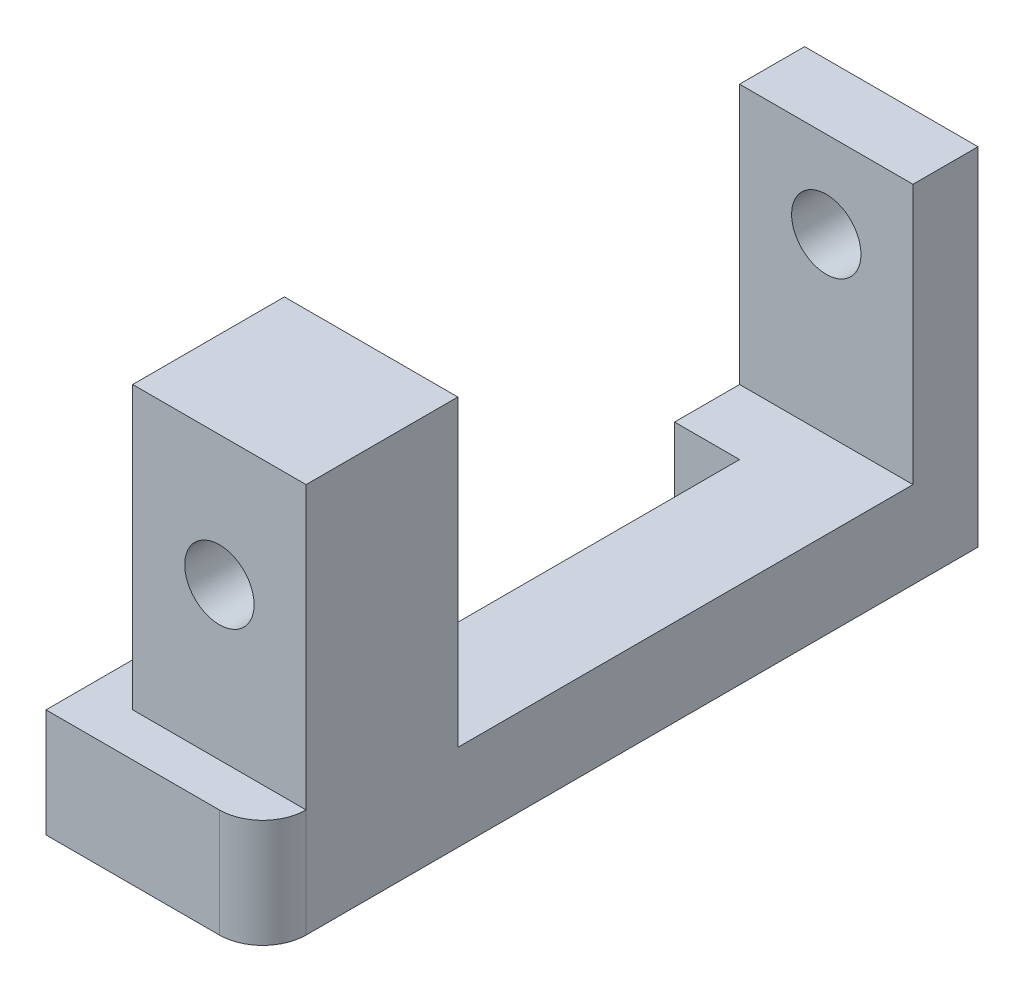
ISO-10303-21;
HEADER;
FILE_DESCRIPTION(('STEP AP214'),'2;1');
FILE_NAME('part.step','',(''),(''),'','','');
FILE_SCHEMA(('AUTOMOTIVE_DESIGN { 1 0 10303 214 1 1 1 1 }'));
ENDSEC;
DATA;
#1=APPLICATION_CONTEXT('core data for automotive mechanical design processes');
#2=APPLICATION_PROTOCOL_DEFINITION('international standard','automotive_design',2000,#1);
#3=PRODUCT_CONTEXT('',#1,'mechanical');
#4=PRODUCT('Part','Part','',(#3));
#5=PRODUCT_RELATED_PRODUCT_CATEGORY('part','',(#4));
#6=PRODUCT_DEFINITION_FORMATION('','',#4);
#7=PRODUCT_DEFINITION_CONTEXT('part definition',#1,'design');
#8=PRODUCT_DEFINITION('design','',#6,#7);
#9=PRODUCT_DEFINITION_SHAPE('','',#8);
#10=(LENGTH_UNIT() NAMED_UNIT(*) SI_UNIT(.MILLI.,.METRE.));
#11=(NAMED_UNIT(*) PLANE_ANGLE_UNIT() SI_UNIT($,.RADIAN.));
#12=(NAMED_UNIT(*) SI_UNIT($,.STERADIAN.) SOLID_ANGLE_UNIT());
#13=UNCERTAINTY_MEASURE_WITH_UNIT(LENGTH_MEASURE(1.E-05),#10,'distance_accuracy_value','');
#14=(GEOMETRIC_REPRESENTATION_CONTEXT(3) GLOBAL_UNCERTAINTY_ASSIGNED_CONTEXT((#13)) GLOBAL_UNIT_ASSIGNED_CONTEXT((#10,
#11,#12)) REPRESENTATION_CONTEXT('',''));
#15=CARTESIAN_POINT('',(0.,0.,0.));
#16=DIRECTION('',(0.,0.,1.));
#17=DIRECTION('',(1.,0.,0.));
#18=AXIS2_PLACEMENT_3D('',#15,#16,#17);
#19=CARTESIAN_POINT('',(-8.,0.,0.));
#20=DIRECTION('',(1.,0.,0.));
#21=DIRECTION('',(0.,0.,-1.));
#22=AXIS2_PLACEMENT_3D('',#19,#20,#21);
#23=PLANE('',#22);
#24=DIRECTION('',(0.,0.,1.));
#25=VECTOR('',#24,1.);
#26=CARTESIAN_POINT('',(-8.,5.,31.));
#27=LINE('',#26,#25);
#28=CARTESIAN_POINT('',(-8.,5.,24.));
#29=VERTEX_POINT('',#28);
#30=CARTESIAN_POINT('',(-8.,5.,31.));
#31=VERTEX_POINT('',#30);
#32=EDGE_CURVE('E268',#29,#31,#27,.T.);
#33=ORIENTED_EDGE('',*,*,#32,.T.);
#34=DIRECTION('',(0.,-1.,0.));
#35=VECTOR('',#34,1.);
#36=CARTESIAN_POINT('',(-8.,18.,31.));
#37=LINE('',#36,#35);
#38=CARTESIAN_POINT('',(-8.,18.,31.));
#39=VERTEX_POINT('',#38);
#40=EDGE_CURVE('E145',#39,#31,#37,.T.);
#41=ORIENTED_EDGE('',*,*,#40,.F.);
#42=DIRECTION('',(0.,0.,1.));
#43=VECTOR('',#42,1.);
#44=CARTESIAN_POINT('',(-8.,18.,24.));
#45=LINE('',#44,#43);
#46=CARTESIAN_POINT('',(-8.,18.,24.));
#47=VERTEX_POINT('',#46);
#48=EDGE_CURVE('E143',#47,#39,#45,.T.);
#49=ORIENTED_EDGE('',*,*,#48,.F.);
#50=DIRECTION('',(0.,1.,0.));
#51=VECTOR('',#50,1.);
#52=CARTESIAN_POINT('',(-8.,4.,24.));
#53=LINE('',#52,#51);
#54=EDGE_CURVE('E132',#29,#47,#53,.T.);
#55=ORIENTED_EDGE('',*,*,#54,.F.);
#56=EDGE_LOOP('',(#33,#41,#49,#55));
#57=FACE_BOUND('',#56,.T.);
#58=ADVANCED_FACE('F33',(#57),#23,.F.);
#59=CARTESIAN_POINT('',(-8.,18.,31.));
#60=DIRECTION('',(0.,0.,1.));
#61=DIRECTION('',(0.,-1.,0.));
#62=AXIS2_PLACEMENT_3D('',#59,#60,#61);
#63=PLANE('',#62);
#64=CARTESIAN_POINT('',(-4.,12.,31.));
#65=DIRECTION('',(0.,0.,1.));
#66=DIRECTION('',(1.,0.,0.));
#67=AXIS2_PLACEMENT_3D('',#64,#65,#66);
#68=CIRCLE('',#67,1.6);
#69=CARTESIAN_POINT('',(-2.4,12.,31.));
#70=VERTEX_POINT('',#69);
#71=EDGE_CURVE('E350',#70,#70,#68,.T.);
#72=ORIENTED_EDGE('',*,*,#71,.F.);
#73=EDGE_LOOP('',(#72));
#74=FACE_BOUND('',#73,.T.);
#75=ORIENTED_EDGE('',*,*,#40,.T.);
#76=DIRECTION('',(1.,0.,0.));
#77=VECTOR('',#76,1.);
#78=CARTESIAN_POINT('',(0.,5.,31.));
#79=LINE('',#78,#77);
#80=CARTESIAN_POINT('',(0.,5.,31.));
#81=VERTEX_POINT('',#80);
#82=EDGE_CURVE('E285',#31,#81,#79,.T.);
#83=ORIENTED_EDGE('',*,*,#82,.T.);
#84=DIRECTION('',(0.,-1.,0.));
#85=VECTOR('',#84,1.);
#86=CARTESIAN_POINT('',(0.,18.,31.));
#87=LINE('',#86,#85);
#88=CARTESIAN_POINT('',(0.,18.,31.));
#89=VERTEX_POINT('',#88);
#90=EDGE_CURVE('E166',#89,#81,#87,.T.);
#91=ORIENTED_EDGE('',*,*,#90,.F.);
#92=DIRECTION('',(1.,0.,0.));
#93=VECTOR('',#92,1.);
#94=CARTESIAN_POINT('',(-8.,18.,31.));
#95=LINE('',#94,#93);
#96=EDGE_CURVE('E11',#39,#89,#95,.T.);
#97=ORIENTED_EDGE('',*,*,#96,.F.);
#98=EDGE_LOOP('',(#75,#83,#91,#97));
#99=FACE_BOUND('',#98,.T.);
#100=ADVANCED_FACE('F312',(#74,#99),#63,.T.);
#101=CARTESIAN_POINT('',(-8.,16.,3.));
#102=DIRECTION('',(0.,0.,1.));
#103=DIRECTION('',(0.,-1.,0.));
#104=AXIS2_PLACEMENT_3D('',#101,#102,#103);
#105=PLANE('',#104);
#106=CARTESIAN_POINT('',(-4.,12.,3.));
#107=DIRECTION('',(0.,0.,1.));
#108=DIRECTION('',(0.,-1.,0.));
#109=AXIS2_PLACEMENT_3D('',#106,#107,#108);
#110=CIRCLE('',#109,1.6);
#111=CARTESIAN_POINT('',(-4.,10.4,3.));
#112=VERTEX_POINT('',#111);
#113=EDGE_CURVE('E292',#112,#112,#110,.T.);
#114=ORIENTED_EDGE('',*,*,#113,.F.);
#115=EDGE_LOOP('',(#114));
#116=FACE_BOUND('',#115,.T.);
#117=DIRECTION('',(0.,-1.,0.));
#118=VECTOR('',#117,1.);
#119=CARTESIAN_POINT('',(-8.,16.,3.));
#120=LINE('',#119,#118);
#121=CARTESIAN_POINT('',(-8.,16.,3.));
#122=VERTEX_POINT('',#121);
#123=CARTESIAN_POINT('',(-8.,4.,3.));
#124=VERTEX_POINT('',#123);
#125=EDGE_CURVE('E112',#122,#124,#120,.T.);
#126=ORIENTED_EDGE('',*,*,#125,.T.);
#127=DIRECTION('',(1.,0.,0.));
#128=VECTOR('',#127,1.);
#129=CARTESIAN_POINT('',(-8.,4.,3.));
#130=LINE('',#129,#128);
#131=CARTESIAN_POINT('',(0.,4.,3.));
#132=VERTEX_POINT('',#131);
#133=EDGE_CURVE('E119',#124,#132,#130,.T.);
#134=ORIENTED_EDGE('',*,*,#133,.T.);
#135=DIRECTION('',(0.,-1.,0.));
#136=VECTOR('',#135,1.);
#137=CARTESIAN_POINT('',(0.,16.,3.));
#138=LINE('',#137,#136);
#139=CARTESIAN_POINT('',(0.,16.,3.));
#140=VERTEX_POINT('',#139);
#141=EDGE_CURVE('E114',#140,#132,#138,.T.);
#142=ORIENTED_EDGE('',*,*,#141,.F.);
#143=DIRECTION('',(1.,0.,0.));
#144=VECTOR('',#143,1.);
#145=CARTESIAN_POINT('',(-8.,16.,3.));
#146=LINE('',#145,#144);
#147=EDGE_CURVE('E108',#122,#140,#146,.T.);
#148=ORIENTED_EDGE('',*,*,#147,.F.);
#149=EDGE_LOOP('',(#126,#134,#142,#148));
#150=FACE_BOUND('',#149,.T.);
#151=ADVANCED_FACE('F110',(#116,#150),#105,.T.);
#152=CARTESIAN_POINT('',(-3.,0.,30.4031242374328));
#153=DIRECTION('',(-0.894427190999916,-0.447213595499958,0.));
#154=DIRECTION('',(0.447213595499958,-0.894427190999916,0.));
#155=AXIS2_PLACEMENT_3D('',#152,#153,#154);
#156=PLANE('',#155);
#157=DIRECTION('',(0.,0.,-1.));
#158=VECTOR('',#157,1.);
#159=CARTESIAN_POINT('',(-5.,4.,30.4031242374328));
#160=LINE('',#159,#158);
#161=CARTESIAN_POINT('',(-5.,4.,24.));
#162=VERTEX_POINT('',#161);
#163=CARTESIAN_POINT('',(-5.,4.,6.));
#164=VERTEX_POINT('',#163);
#165=EDGE_CURVE('E203',#162,#164,#160,.T.);
#166=ORIENTED_EDGE('',*,*,#165,.T.);
#167=DIRECTION('',(-0.447213595499958,0.894427190999916,0.));
#168=VECTOR('',#167,1.);
#169=CARTESIAN_POINT('',(-5.,4.,6.));
#170=LINE('',#169,#168);
#171=CARTESIAN_POINT('',(-3.,0.,6.));
#172=VERTEX_POINT('',#171);
#173=EDGE_CURVE('E197',#172,#164,#170,.T.);
#174=ORIENTED_EDGE('',*,*,#173,.F.);
#175=DIRECTION('',(0.,0.,-1.));
#176=VECTOR('',#175,1.);
#177=CARTESIAN_POINT('',(-3.,0.,30.4031242374328));
#178=LINE('',#177,#176);
#179=CARTESIAN_POINT('',(-3.,0.,24.));
#180=VERTEX_POINT('',#179);
#181=EDGE_CURVE('E207',#180,#172,#178,.T.);
#182=ORIENTED_EDGE('',*,*,#181,.F.);
#183=DIRECTION('',(0.447213595499958,-0.894427190999916,0.));
#184=VECTOR('',#183,1.);
#185=CARTESIAN_POINT('',(-3.,0.,24.));
#186=LINE('',#185,#184);
#187=EDGE_CURVE('E204',#162,#180,#186,.T.);
#188=ORIENTED_EDGE('',*,*,#187,.F.);
#189=EDGE_LOOP('',(#166,#174,#182,#188));
#190=FACE_BOUND('',#189,.T.);
#191=ADVANCED_FACE('F218',(#190),#156,.T.);
#192=CARTESIAN_POINT('',(-8.,0.,31.));
#193=DIRECTION('',(0.,-1.,0.));
#194=DIRECTION('',(0.,0.,-1.));
#195=AXIS2_PLACEMENT_3D('',#192,#193,#194);
#196=PLANE('',#195);
#197=CARTESIAN_POINT('',(-8.,0.,26.));
#198=DIRECTION('',(0.,-1.,0.));
#199=DIRECTION('',(0.,0.,-1.));
#200=AXIS2_PLACEMENT_3D('',#197,#198,#199);
#201=CIRCLE('',#200,2.);
#202=CARTESIAN_POINT('',(-10.,0.,26.));
#203=VERTEX_POINT('',#202);
#204=CARTESIAN_POINT('',(-8.,0.,24.));
#205=VERTEX_POINT('',#204);
#206=EDGE_CURVE('E290',#203,#205,#201,.T.);
#207=ORIENTED_EDGE('',*,*,#206,.T.);
#208=DIRECTION('',(-1.,0.,0.));
#209=VECTOR('',#208,1.);
#210=CARTESIAN_POINT('',(-8.,0.,24.));
#211=LINE('',#210,#209);
#212=EDGE_CURVE('E151',#180,#205,#211,.T.);
#213=ORIENTED_EDGE('',*,*,#212,.F.);
#214=ORIENTED_EDGE('',*,*,#181,.T.);
#215=DIRECTION('',(1.,0.,0.));
#216=VECTOR('',#215,1.);
#217=CARTESIAN_POINT('',(-3.,0.,6.));
#218=LINE('',#217,#216);
#219=CARTESIAN_POINT('',(-8.,0.,6.));
#220=VERTEX_POINT('',#219);
#221=EDGE_CURVE('E50',#220,#172,#218,.T.);
#222=ORIENTED_EDGE('',*,*,#221,.F.);
#223=DIRECTION('',(0.,0.,-1.));
#224=VECTOR('',#223,1.);
#225=CARTESIAN_POINT('',(-8.,0.,31.));
#226=LINE('',#225,#224);
#227=CARTESIAN_POINT('',(-8.,0.,0.));
#228=VERTEX_POINT('',#227);
#229=EDGE_CURVE('E98',#220,#228,#226,.T.);
#230=ORIENTED_EDGE('',*,*,#229,.T.);
#231=DIRECTION('',(1.,0.,0.));
#232=VECTOR('',#231,1.);
#233=CARTESIAN_POINT('',(-8.,0.,0.));
#234=LINE('',#233,#232);
#235=CARTESIAN_POINT('',(0.,0.,0.));
#236=VERTEX_POINT('',#235);
#237=EDGE_CURVE('E37',#228,#236,#234,.T.);
#238=ORIENTED_EDGE('',*,*,#237,.T.);
#239=DIRECTION('',(0.,0.,-1.));
#240=VECTOR('',#239,1.);
#241=CARTESIAN_POINT('',(0.,0.,31.));
#242=LINE('',#241,#240);
#243=CARTESIAN_POINT('',(0.,0.,31.));
#244=VERTEX_POINT('',#243);
#245=EDGE_CURVE('E147',#244,#236,#242,.T.);
#246=ORIENTED_EDGE('',*,*,#245,.F.);
#247=CARTESIAN_POINT('',(-2.,0.,31.));
#248=DIRECTION('',(0.,-1.,0.));
#249=DIRECTION('',(0.,0.,1.));
#250=AXIS2_PLACEMENT_3D('',#247,#248,#249);
#251=CIRCLE('',#250,2.);
#252=CARTESIAN_POINT('',(-2.,0.,33.));
#253=VERTEX_POINT('',#252);
#254=EDGE_CURVE('E91',#244,#253,#251,.T.);
#255=ORIENTED_EDGE('',*,*,#254,.T.);
#256=DIRECTION('',(-1.,0.,0.));
#257=VECTOR('',#256,1.);
#258=CARTESIAN_POINT('',(-10.,0.,33.));
#259=LINE('',#258,#257);
#260=CARTESIAN_POINT('',(-10.,0.,33.));
#261=VERTEX_POINT('',#260);
#262=EDGE_CURVE('E279',#253,#261,#259,.T.);
#263=ORIENTED_EDGE('',*,*,#262,.T.);
#264=DIRECTION('',(0.,0.,-1.));
#265=VECTOR('',#264,1.);
#266=CARTESIAN_POINT('',(-10.,0.,26.));
#267=LINE('',#266,#265);
#268=EDGE_CURVE('E295',#261,#203,#267,.T.);
#269=ORIENTED_EDGE('',*,*,#268,.T.);
#270=EDGE_LOOP('',(#207,#213,#214,#222,#230,#238,#246,#255,#263,#269));
#271=FACE_BOUND('',#270,.T.);
#272=ADVANCED_FACE('F35',(#271),#196,.T.);
#273=CARTESIAN_POINT('',(-8.,4.,3.));
#274=DIRECTION('',(0.,1.,0.));
#275=DIRECTION('',(0.,0.,1.));
#276=AXIS2_PLACEMENT_3D('',#273,#274,#275);
#277=PLANE('',#276);
#278=ORIENTED_EDGE('',*,*,#133,.F.);
#279=DIRECTION('',(0.,0.,-1.));
#280=VECTOR('',#279,1.);
#281=CARTESIAN_POINT('',(-8.,4.,6.));
#282=LINE('',#281,#280);
#283=CARTESIAN_POINT('',(-8.,4.,6.));
#284=VERTEX_POINT('',#283);
#285=EDGE_CURVE('E131',#284,#124,#282,.T.);
#286=ORIENTED_EDGE('',*,*,#285,.F.);
#287=DIRECTION('',(-1.,0.,0.));
#288=VECTOR('',#287,1.);
#289=CARTESIAN_POINT('',(-8.,4.,6.));
#290=LINE('',#289,#288);
#291=EDGE_CURVE('E199',#164,#284,#290,.T.);
#292=ORIENTED_EDGE('',*,*,#291,.F.);
#293=ORIENTED_EDGE('',*,*,#165,.F.);
#294=DIRECTION('',(1.,0.,0.));
#295=VECTOR('',#294,1.);
#296=CARTESIAN_POINT('',(-8.,4.,24.));
#297=LINE('',#296,#295);
#298=CARTESIAN_POINT('',(0.,4.,24.));
#299=VERTEX_POINT('',#298);
#300=EDGE_CURVE('E170',#162,#299,#297,.T.);
#301=ORIENTED_EDGE('',*,*,#300,.T.);
#302=DIRECTION('',(0.,0.,1.));
#303=VECTOR('',#302,1.);
#304=CARTESIAN_POINT('',(0.,4.,3.));
#305=LINE('',#304,#303);
#306=EDGE_CURVE('E157',#132,#299,#305,.T.);
#307=ORIENTED_EDGE('',*,*,#306,.F.);
#308=EDGE_LOOP('',(#278,#286,#292,#293,#301,#307));
#309=FACE_BOUND('',#308,.T.);
#310=ADVANCED_FACE('F230',(#309),#277,.T.);
#311=ORIENTED_EDGE('',*,*,#229,.F.);
#312=DIRECTION('',(0.,-1.,0.));
#313=VECTOR('',#312,1.);
#314=CARTESIAN_POINT('',(-8.,0.,6.));
#315=LINE('',#314,#313);
#316=EDGE_CURVE('E193',#284,#220,#315,.T.);
#317=ORIENTED_EDGE('',*,*,#316,.F.);
#318=ORIENTED_EDGE('',*,*,#285,.T.);
#319=ORIENTED_EDGE('',*,*,#125,.F.);
#320=DIRECTION('',(0.,0.,1.));
#321=VECTOR('',#320,1.);
#322=CARTESIAN_POINT('',(-8.,16.,0.));
#323=LINE('',#322,#321);
#324=CARTESIAN_POINT('',(-8.,16.,0.));
#325=VERTEX_POINT('',#324);
#326=EDGE_CURVE('E127',#325,#122,#323,.T.);
#327=ORIENTED_EDGE('',*,*,#326,.F.);
#328=DIRECTION('',(0.,1.,0.));
#329=VECTOR('',#328,1.);
#330=CARTESIAN_POINT('',(-8.,0.,0.));
#331=LINE('',#330,#329);
#332=EDGE_CURVE('E135',#228,#325,#331,.T.);
#333=ORIENTED_EDGE('',*,*,#332,.F.);
#334=EDGE_LOOP('',(#311,#317,#318,#319,#327,#333));
#335=FACE_BOUND('',#334,.T.);
#336=ADVANCED_FACE('F125',(#335),#23,.F.);
#337=CARTESIAN_POINT('',(-8.,18.,24.));
#338=DIRECTION('',(0.,1.,0.));
#339=DIRECTION('',(0.,0.,1.));
#340=AXIS2_PLACEMENT_3D('',#337,#338,#339);
#341=PLANE('',#340);
#342=DIRECTION('',(0.,0.,1.));
#343=VECTOR('',#342,1.);
#344=CARTESIAN_POINT('',(0.,18.,24.));
#345=LINE('',#344,#343);
#346=CARTESIAN_POINT('',(0.,18.,24.));
#347=VERTEX_POINT('',#346);
#348=EDGE_CURVE('E163',#347,#89,#345,.T.);
#349=ORIENTED_EDGE('',*,*,#348,.F.);
#350=DIRECTION('',(1.,0.,0.));
#351=VECTOR('',#350,1.);
#352=CARTESIAN_POINT('',(-8.,18.,24.));
#353=LINE('',#352,#351);
#354=EDGE_CURVE('E42',#47,#347,#353,.T.);
#355=ORIENTED_EDGE('',*,*,#354,.F.);
#356=ORIENTED_EDGE('',*,*,#48,.T.);
#357=ORIENTED_EDGE('',*,*,#96,.T.);
#358=EDGE_LOOP('',(#349,#355,#356,#357));
#359=FACE_BOUND('',#358,.T.);
#360=ADVANCED_FACE('F323',(#359),#341,.T.);
#361=CARTESIAN_POINT('',(-8.,4.,24.));
#362=DIRECTION('',(0.,0.,-1.));
#363=DIRECTION('',(-1.,0.,0.));
#364=AXIS2_PLACEMENT_3D('',#361,#362,#363);
#365=PLANE('',#364);
#366=CARTESIAN_POINT('',(-4.,12.,24.));
#367=DIRECTION('',(0.,0.,-1.));
#368=DIRECTION('',(-1.,0.,0.));
#369=AXIS2_PLACEMENT_3D('',#366,#367,#368);
#370=CIRCLE('',#369,1.6);
#371=CARTESIAN_POINT('',(-5.6,12.,24.));
#372=VERTEX_POINT('',#371);
#373=EDGE_CURVE('E349',#372,#372,#370,.T.);
#374=ORIENTED_EDGE('',*,*,#373,.F.);
#375=EDGE_LOOP('',(#374));
#376=FACE_BOUND('',#375,.T.);
#377=DIRECTION('',(0.,1.,0.));
#378=VECTOR('',#377,1.);
#379=CARTESIAN_POINT('',(0.,4.,24.));
#380=LINE('',#379,#378);
#381=EDGE_CURVE('E160',#299,#347,#380,.T.);
#382=ORIENTED_EDGE('',*,*,#381,.F.);
#383=ORIENTED_EDGE('',*,*,#300,.F.);
#384=ORIENTED_EDGE('',*,*,#187,.T.);
#385=ORIENTED_EDGE('',*,*,#212,.T.);
#386=EDGE_CURVE('E140',#205,#29,#53,.T.);
#387=ORIENTED_EDGE('',*,*,#386,.T.);
#388=ORIENTED_EDGE('',*,*,#54,.T.);
#389=ORIENTED_EDGE('',*,*,#354,.T.);
#390=EDGE_LOOP('',(#382,#383,#384,#385,#387,#388,#389));
#391=FACE_BOUND('',#390,.T.);
#392=ADVANCED_FACE('F224',(#376,#391),#365,.T.);
#393=CARTESIAN_POINT('',(-8.,16.,0.));
#394=DIRECTION('',(0.,1.,0.));
#395=DIRECTION('',(0.,0.,1.));
#396=AXIS2_PLACEMENT_3D('',#393,#394,#395);
#397=PLANE('',#396);
#398=DIRECTION('',(0.,0.,1.));
#399=VECTOR('',#398,1.);
#400=CARTESIAN_POINT('',(0.,16.,0.));
#401=LINE('',#400,#399);
#402=CARTESIAN_POINT('',(0.,16.,0.));
#403=VERTEX_POINT('',#402);
#404=EDGE_CURVE('E154',#403,#140,#401,.T.);
#405=ORIENTED_EDGE('',*,*,#404,.F.);
#406=DIRECTION('',(1.,0.,0.));
#407=VECTOR('',#406,1.);
#408=CARTESIAN_POINT('',(-8.,16.,0.));
#409=LINE('',#408,#407);
#410=EDGE_CURVE('E120',#325,#403,#409,.T.);
#411=ORIENTED_EDGE('',*,*,#410,.F.);
#412=ORIENTED_EDGE('',*,*,#326,.T.);
#413=ORIENTED_EDGE('',*,*,#147,.T.);
#414=EDGE_LOOP('',(#405,#411,#412,#413));
#415=FACE_BOUND('',#414,.T.);
#416=ADVANCED_FACE('F134',(#415),#397,.T.);
#417=CARTESIAN_POINT('',(-8.,0.,0.));
#418=DIRECTION('',(0.,0.,-1.));
#419=DIRECTION('',(-1.,0.,0.));
#420=AXIS2_PLACEMENT_3D('',#417,#418,#419);
#421=PLANE('',#420);
#422=CARTESIAN_POINT('',(-4.,12.,0.));
#423=DIRECTION('',(0.,0.,1.));
#424=DIRECTION('',(1.,0.,0.));
#425=AXIS2_PLACEMENT_3D('',#422,#423,#424);
#426=CIRCLE('',#425,1.6);
#427=CARTESIAN_POINT('',(-2.4,12.,0.));
#428=VERTEX_POINT('',#427);
#429=EDGE_CURVE('E347',#428,#428,#426,.T.);
#430=ORIENTED_EDGE('',*,*,#429,.T.);
#431=EDGE_LOOP('',(#430));
#432=FACE_BOUND('',#431,.T.);
#433=DIRECTION('',(0.,1.,0.));
#434=VECTOR('',#433,1.);
#435=CARTESIAN_POINT('',(0.,0.,0.));
#436=LINE('',#435,#434);
#437=EDGE_CURVE('E150',#236,#403,#436,.T.);
#438=ORIENTED_EDGE('',*,*,#437,.F.);
#439=ORIENTED_EDGE('',*,*,#237,.F.);
#440=ORIENTED_EDGE('',*,*,#332,.T.);
#441=ORIENTED_EDGE('',*,*,#410,.T.);
#442=EDGE_LOOP('',(#438,#439,#440,#441));
#443=FACE_BOUND('',#442,.T.);
#444=ADVANCED_FACE('F176',(#432,#443),#421,.T.);
#445=CARTESIAN_POINT('',(0.,0.,0.));
#446=DIRECTION('',(1.,0.,0.));
#447=DIRECTION('',(0.,0.,-1.));
#448=AXIS2_PLACEMENT_3D('',#445,#446,#447);
#449=PLANE('',#448);
#450=ORIENTED_EDGE('',*,*,#245,.T.);
#451=ORIENTED_EDGE('',*,*,#437,.T.);
#452=ORIENTED_EDGE('',*,*,#404,.T.);
#453=ORIENTED_EDGE('',*,*,#141,.T.);
#454=ORIENTED_EDGE('',*,*,#306,.T.);
#455=ORIENTED_EDGE('',*,*,#381,.T.);
#456=ORIENTED_EDGE('',*,*,#348,.T.);
#457=ORIENTED_EDGE('',*,*,#90,.T.);
#458=DIRECTION('',(0.,-1.,0.));
#459=VECTOR('',#458,1.);
#460=CARTESIAN_POINT('',(0.,5.,31.));
#461=LINE('',#460,#459);
#462=EDGE_CURVE('E179',#81,#244,#461,.T.);
#463=ORIENTED_EDGE('',*,*,#462,.T.);
#464=EDGE_LOOP('',(#450,#451,#452,#453,#454,#455,#456,#457,#463));
#465=FACE_BOUND('',#464,.T.);
#466=ADVANCED_FACE('F178',(#465),#449,.T.);
#467=CARTESIAN_POINT('',(0.,0.,6.));
#468=DIRECTION('',(0.,0.,-1.));
#469=DIRECTION('',(-1.,0.,0.));
#470=AXIS2_PLACEMENT_3D('',#467,#468,#469);
#471=PLANE('',#470);
#472=ORIENTED_EDGE('',*,*,#316,.T.);
#473=ORIENTED_EDGE('',*,*,#221,.T.);
#474=ORIENTED_EDGE('',*,*,#173,.T.);
#475=ORIENTED_EDGE('',*,*,#291,.T.);
#476=EDGE_LOOP('',(#472,#473,#474,#475));
#477=FACE_BOUND('',#476,.T.);
#478=ADVANCED_FACE('F308',(#477),#471,.F.);
#479=CARTESIAN_POINT('',(-8.,5.,26.));
#480=DIRECTION('',(0.,-1.,0.));
#481=DIRECTION('',(0.,0.,-1.));
#482=AXIS2_PLACEMENT_3D('',#479,#480,#481);
#483=CYLINDRICAL_SURFACE('',#482,2.);
#484=ORIENTED_EDGE('',*,*,#206,.F.);
#485=DIRECTION('',(0.,-1.,0.));
#486=VECTOR('',#485,1.);
#487=CARTESIAN_POINT('',(-10.,5.,26.));
#488=LINE('',#487,#486);
#489=CARTESIAN_POINT('',(-10.,5.,26.));
#490=VERTEX_POINT('',#489);
#491=EDGE_CURVE('E195',#490,#203,#488,.T.);
#492=ORIENTED_EDGE('',*,*,#491,.F.);
#493=CARTESIAN_POINT('',(-8.,5.,26.));
#494=DIRECTION('',(0.,-1.,0.));
#495=DIRECTION('',(0.,0.,-1.));
#496=AXIS2_PLACEMENT_3D('',#493,#494,#495);
#497=CIRCLE('',#496,2.);
#498=EDGE_CURVE('E298',#490,#29,#497,.T.);
#499=ORIENTED_EDGE('',*,*,#498,.T.);
#500=ORIENTED_EDGE('',*,*,#386,.F.);
#501=EDGE_LOOP('',(#484,#492,#499,#500));
#502=FACE_BOUND('',#501,.T.);
#503=ADVANCED_FACE('F301',(#502),#483,.T.);
#504=CARTESIAN_POINT('',(-10.,5.,26.));
#505=DIRECTION('',(-1.,0.,0.));
#506=DIRECTION('',(0.,0.,1.));
#507=AXIS2_PLACEMENT_3D('',#504,#505,#506);
#508=PLANE('',#507);
#509=ORIENTED_EDGE('',*,*,#268,.F.);
#510=DIRECTION('',(0.,-1.,0.));
#511=VECTOR('',#510,1.);
#512=CARTESIAN_POINT('',(-10.,5.,33.));
#513=LINE('',#512,#511);
#514=CARTESIAN_POINT('',(-10.,5.,33.));
#515=VERTEX_POINT('',#514);
#516=EDGE_CURVE('E186',#515,#261,#513,.T.);
#517=ORIENTED_EDGE('',*,*,#516,.F.);
#518=DIRECTION('',(0.,0.,-1.));
#519=VECTOR('',#518,1.);
#520=CARTESIAN_POINT('',(-10.,5.,26.));
#521=LINE('',#520,#519);
#522=EDGE_CURVE('E184',#515,#490,#521,.T.);
#523=ORIENTED_EDGE('',*,*,#522,.T.);
#524=ORIENTED_EDGE('',*,*,#491,.T.);
#525=EDGE_LOOP('',(#509,#517,#523,#524));
#526=FACE_BOUND('',#525,.T.);
#527=ADVANCED_FACE('F299',(#526),#508,.T.);
#528=CARTESIAN_POINT('',(-10.,5.,33.));
#529=DIRECTION('',(0.,0.,1.));
#530=DIRECTION('',(1.,0.,0.));
#531=AXIS2_PLACEMENT_3D('',#528,#529,#530);
#532=PLANE('',#531);
#533=ORIENTED_EDGE('',*,*,#262,.F.);
#534=DIRECTION('',(0.,-1.,0.));
#535=VECTOR('',#534,1.);
#536=CARTESIAN_POINT('',(-2.,5.,33.));
#537=LINE('',#536,#535);
#538=CARTESIAN_POINT('',(-2.,5.,33.));
#539=VERTEX_POINT('',#538);
#540=EDGE_CURVE('E183',#539,#253,#537,.T.);
#541=ORIENTED_EDGE('',*,*,#540,.F.);
#542=DIRECTION('',(-1.,0.,0.));
#543=VECTOR('',#542,1.);
#544=CARTESIAN_POINT('',(-10.,5.,33.));
#545=LINE('',#544,#543);
#546=EDGE_CURVE('E189',#539,#515,#545,.T.);
#547=ORIENTED_EDGE('',*,*,#546,.T.);
#548=ORIENTED_EDGE('',*,*,#516,.T.);
#549=EDGE_LOOP('',(#533,#541,#547,#548));
#550=FACE_BOUND('',#549,.T.);
#551=ADVANCED_FACE('F276',(#550),#532,.T.);
#552=CARTESIAN_POINT('',(-2.,5.,31.));
#553=DIRECTION('',(0.,-1.,0.));
#554=DIRECTION('',(0.,0.,-1.));
#555=AXIS2_PLACEMENT_3D('',#552,#553,#554);
#556=CYLINDRICAL_SURFACE('',#555,2.);
#557=ORIENTED_EDGE('',*,*,#254,.F.);
#558=ORIENTED_EDGE('',*,*,#462,.F.);
#559=CARTESIAN_POINT('',(-2.,5.,31.));
#560=DIRECTION('',(0.,-1.,0.));
#561=DIRECTION('',(0.,0.,1.));
#562=AXIS2_PLACEMENT_3D('',#559,#560,#561);
#563=CIRCLE('',#562,2.);
#564=EDGE_CURVE('E281',#81,#539,#563,.T.);
#565=ORIENTED_EDGE('',*,*,#564,.T.);
#566=ORIENTED_EDGE('',*,*,#540,.T.);
#567=EDGE_LOOP('',(#557,#558,#565,#566));
#568=FACE_BOUND('',#567,.T.);
#569=ADVANCED_FACE('F284',(#568),#556,.T.);
#570=CARTESIAN_POINT('',(-8.,5.,26.));
#571=DIRECTION('',(0.,-1.,0.));
#572=DIRECTION('',(0.,0.,-1.));
#573=AXIS2_PLACEMENT_3D('',#570,#571,#572);
#574=PLANE('',#573);
#575=ORIENTED_EDGE('',*,*,#498,.F.);
#576=ORIENTED_EDGE('',*,*,#522,.F.);
#577=ORIENTED_EDGE('',*,*,#546,.F.);
#578=ORIENTED_EDGE('',*,*,#564,.F.);
#579=ORIENTED_EDGE('',*,*,#82,.F.);
#580=ORIENTED_EDGE('',*,*,#32,.F.);
#581=EDGE_LOOP('',(#575,#576,#577,#578,#579,#580));
#582=FACE_BOUND('',#581,.T.);
#583=ADVANCED_FACE('F280',(#582),#574,.F.);
#584=CARTESIAN_POINT('',(-4.,12.,0.));
#585=DIRECTION('',(0.,0.,1.));
#586=DIRECTION('',(1.,0.,0.));
#587=AXIS2_PLACEMENT_3D('',#584,#585,#586);
#588=CYLINDRICAL_SURFACE('',#587,1.6);
#589=ORIENTED_EDGE('',*,*,#113,.T.);
#590=EDGE_LOOP('',(#589));
#591=FACE_BOUND('',#590,.T.);
#592=ORIENTED_EDGE('',*,*,#429,.F.);
#593=EDGE_LOOP('',(#592));
#594=FACE_BOUND('',#593,.T.);
#595=ADVANCED_FACE('F366',(#591,#594),#588,.F.);
#596=ORIENTED_EDGE('',*,*,#373,.T.);
#597=EDGE_LOOP('',(#596));
#598=FACE_BOUND('',#597,.T.);
#599=ORIENTED_EDGE('',*,*,#71,.T.);
#600=EDGE_LOOP('',(#599));
#601=FACE_BOUND('',#600,.T.);
#602=ADVANCED_FACE('F368',(#598,#601),#588,.F.);
#603=CLOSED_SHELL('',(#58,#100,#151,#191,#272,#310,#336,#360,#392,#416,#444,#466,#478,#503,#527,
#551,#569,#583,#595,#602));
#604=MANIFOLD_SOLID_BREP('B2',#603);
#605=ADVANCED_BREP_SHAPE_REPRESENTATION('',(#18,#604),#14);
#606=SHAPE_DEFINITION_REPRESENTATION(#9,#605);
ENDSEC;
END-ISO-10303-21;
